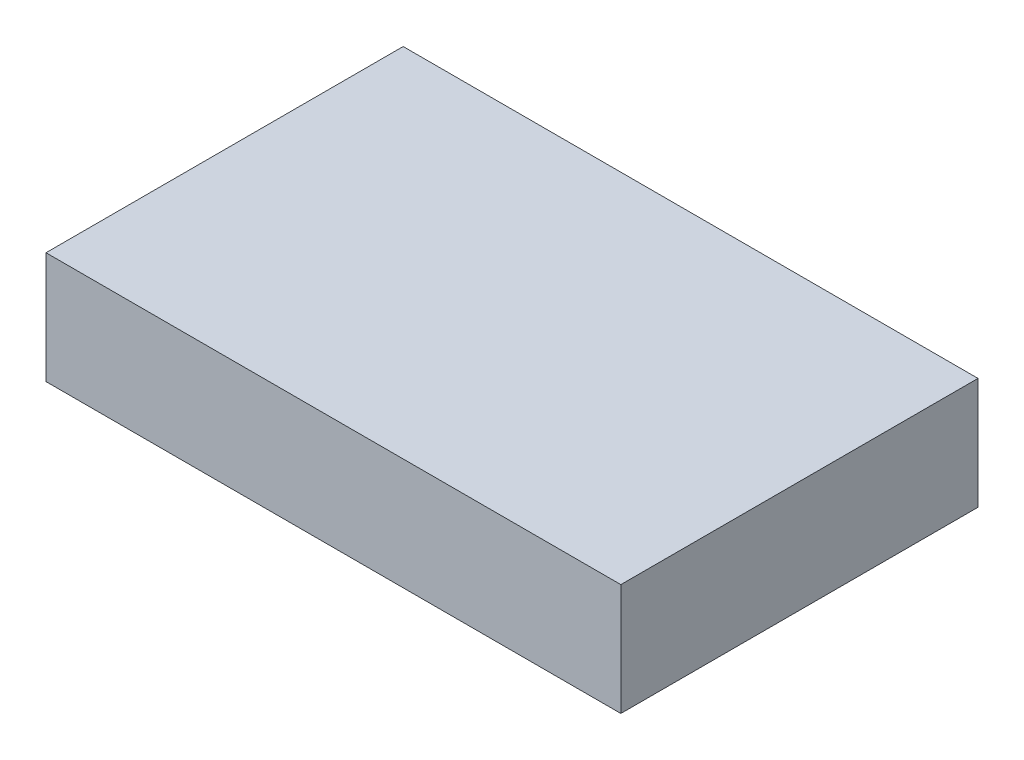
ISO-10303-21;
HEADER;
FILE_DESCRIPTION(('STEP AP214'),'2;1');
FILE_NAME('part.step','',(''),(''),'','','');
FILE_SCHEMA(('AUTOMOTIVE_DESIGN { 1 0 10303 214 1 1 1 1 }'));
ENDSEC;
DATA;
#1=APPLICATION_CONTEXT('core data for automotive mechanical design processes');
#2=APPLICATION_PROTOCOL_DEFINITION('international standard','automotive_design',2000,#1);
#3=PRODUCT_CONTEXT('',#1,'mechanical');
#4=PRODUCT('Part','Part','',(#3));
#5=PRODUCT_RELATED_PRODUCT_CATEGORY('part','',(#4));
#6=PRODUCT_DEFINITION_FORMATION('','',#4);
#7=PRODUCT_DEFINITION_CONTEXT('part definition',#1,'design');
#8=PRODUCT_DEFINITION('design','',#6,#7);
#9=PRODUCT_DEFINITION_SHAPE('','',#8);
#10=(LENGTH_UNIT() NAMED_UNIT(*) SI_UNIT(.MILLI.,.METRE.));
#11=(NAMED_UNIT(*) PLANE_ANGLE_UNIT() SI_UNIT($,.RADIAN.));
#12=(NAMED_UNIT(*) SI_UNIT($,.STERADIAN.) SOLID_ANGLE_UNIT());
#13=UNCERTAINTY_MEASURE_WITH_UNIT(LENGTH_MEASURE(1.E-05),#10,'distance_accuracy_value','');
#14=(GEOMETRIC_REPRESENTATION_CONTEXT(3) GLOBAL_UNCERTAINTY_ASSIGNED_CONTEXT((#13)) GLOBAL_UNIT_ASSIGNED_CONTEXT((#10,
#11,#12)) REPRESENTATION_CONTEXT('',''));
#15=CARTESIAN_POINT('',(0.,0.,0.));
#16=DIRECTION('',(0.,0.,1.));
#17=DIRECTION('',(1.,0.,0.));
#18=AXIS2_PLACEMENT_3D('',#15,#16,#17);
#19=CARTESIAN_POINT('',(6.5405,2.54,4.064));
#20=DIRECTION('',(-1.,0.,0.));
#21=DIRECTION('',(0.,0.,1.));
#22=AXIS2_PLACEMENT_3D('',#19,#20,#21);
#23=PLANE('',#22);
#24=DIRECTION('',(0.,0.,-1.));
#25=VECTOR('',#24,1.);
#26=CARTESIAN_POINT('',(6.5405,0.,4.064));
#27=LINE('',#26,#25);
#28=CARTESIAN_POINT('',(6.5405,0.,4.064));
#29=VERTEX_POINT('',#28);
#30=CARTESIAN_POINT('',(6.5405,0.,-4.064));
#31=VERTEX_POINT('',#30);
#32=EDGE_CURVE('E100',#29,#31,#27,.T.);
#33=ORIENTED_EDGE('',*,*,#32,.T.);
#34=DIRECTION('',(0.,-1.,0.));
#35=VECTOR('',#34,1.);
#36=CARTESIAN_POINT('',(6.5405,2.54,-4.064));
#37=LINE('',#36,#35);
#38=CARTESIAN_POINT('',(6.5405,2.54,-4.064));
#39=VERTEX_POINT('',#38);
#40=EDGE_CURVE('E11',#39,#31,#37,.T.);
#41=ORIENTED_EDGE('',*,*,#40,.F.);
#42=DIRECTION('',(0.,0.,-1.));
#43=VECTOR('',#42,1.);
#44=CARTESIAN_POINT('',(6.5405,2.54,4.064));
#45=LINE('',#44,#43);
#46=CARTESIAN_POINT('',(6.5405,2.54,4.064));
#47=VERTEX_POINT('',#46);
#48=EDGE_CURVE('E88',#47,#39,#45,.T.);
#49=ORIENTED_EDGE('',*,*,#48,.F.);
#50=DIRECTION('',(0.,-1.,0.));
#51=VECTOR('',#50,1.);
#52=CARTESIAN_POINT('',(6.5405,2.54,4.064));
#53=LINE('',#52,#51);
#54=EDGE_CURVE('E96',#47,#29,#53,.T.);
#55=ORIENTED_EDGE('',*,*,#54,.T.);
#56=EDGE_LOOP('',(#33,#41,#49,#55));
#57=FACE_BOUND('',#56,.T.);
#58=ADVANCED_FACE('F37',(#57),#23,.F.);
#59=CARTESIAN_POINT('',(-6.5405,2.54,-4.064));
#60=DIRECTION('',(0.,0.,1.));
#61=DIRECTION('',(1.,0.,0.));
#62=AXIS2_PLACEMENT_3D('',#59,#60,#61);
#63=PLANE('',#62);
#64=DIRECTION('',(-1.,0.,0.));
#65=VECTOR('',#64,1.);
#66=CARTESIAN_POINT('',(-6.5405,0.,-4.064));
#67=LINE('',#66,#65);
#68=CARTESIAN_POINT('',(-6.5405,0.,-4.064));
#69=VERTEX_POINT('',#68);
#70=EDGE_CURVE('E92',#31,#69,#67,.T.);
#71=ORIENTED_EDGE('',*,*,#70,.T.);
#72=DIRECTION('',(0.,-1.,0.));
#73=VECTOR('',#72,1.);
#74=CARTESIAN_POINT('',(-6.5405,2.54,-4.064));
#75=LINE('',#74,#73);
#76=CARTESIAN_POINT('',(-6.5405,2.54,-4.064));
#77=VERTEX_POINT('',#76);
#78=EDGE_CURVE('E45',#77,#69,#75,.T.);
#79=ORIENTED_EDGE('',*,*,#78,.F.);
#80=DIRECTION('',(-1.,0.,0.));
#81=VECTOR('',#80,1.);
#82=CARTESIAN_POINT('',(-6.5405,2.54,-4.064));
#83=LINE('',#82,#81);
#84=EDGE_CURVE('E83',#39,#77,#83,.T.);
#85=ORIENTED_EDGE('',*,*,#84,.F.);
#86=ORIENTED_EDGE('',*,*,#40,.T.);
#87=EDGE_LOOP('',(#71,#79,#85,#86));
#88=FACE_BOUND('',#87,.T.);
#89=ADVANCED_FACE('F91',(#88),#63,.F.);
#90=CARTESIAN_POINT('',(-6.5405,2.54,4.064));
#91=DIRECTION('',(1.,0.,0.));
#92=DIRECTION('',(0.,0.,-1.));
#93=AXIS2_PLACEMENT_3D('',#90,#91,#92);
#94=PLANE('',#93);
#95=DIRECTION('',(0.,0.,1.));
#96=VECTOR('',#95,1.);
#97=CARTESIAN_POINT('',(-6.5405,0.,4.064));
#98=LINE('',#97,#96);
#99=CARTESIAN_POINT('',(-6.5405,0.,4.064));
#100=VERTEX_POINT('',#99);
#101=EDGE_CURVE('E70',#69,#100,#98,.T.);
#102=ORIENTED_EDGE('',*,*,#101,.T.);
#103=DIRECTION('',(0.,-1.,0.));
#104=VECTOR('',#103,1.);
#105=CARTESIAN_POINT('',(-6.5405,2.54,4.064));
#106=LINE('',#105,#104);
#107=CARTESIAN_POINT('',(-6.5405,2.54,4.064));
#108=VERTEX_POINT('',#107);
#109=EDGE_CURVE('E93',#108,#100,#106,.T.);
#110=ORIENTED_EDGE('',*,*,#109,.F.);
#111=DIRECTION('',(0.,0.,1.));
#112=VECTOR('',#111,1.);
#113=CARTESIAN_POINT('',(-6.5405,2.54,4.064));
#114=LINE('',#113,#112);
#115=EDGE_CURVE('E86',#77,#108,#114,.T.);
#116=ORIENTED_EDGE('',*,*,#115,.F.);
#117=ORIENTED_EDGE('',*,*,#78,.T.);
#118=EDGE_LOOP('',(#102,#110,#116,#117));
#119=FACE_BOUND('',#118,.T.);
#120=ADVANCED_FACE('F94',(#119),#94,.F.);
#121=CARTESIAN_POINT('',(-6.5405,2.54,4.064));
#122=DIRECTION('',(0.,0.,-1.));
#123=DIRECTION('',(-1.,0.,0.));
#124=AXIS2_PLACEMENT_3D('',#121,#122,#123);
#125=PLANE('',#124);
#126=DIRECTION('',(1.,0.,0.));
#127=VECTOR('',#126,1.);
#128=CARTESIAN_POINT('',(-6.5405,0.,4.064));
#129=LINE('',#128,#127);
#130=EDGE_CURVE('E76',#100,#29,#129,.T.);
#131=ORIENTED_EDGE('',*,*,#130,.T.);
#132=ORIENTED_EDGE('',*,*,#54,.F.);
#133=DIRECTION('',(1.,0.,0.));
#134=VECTOR('',#133,1.);
#135=CARTESIAN_POINT('',(-6.5405,2.54,4.064));
#136=LINE('',#135,#134);
#137=EDGE_CURVE('E53',#108,#47,#136,.T.);
#138=ORIENTED_EDGE('',*,*,#137,.F.);
#139=ORIENTED_EDGE('',*,*,#109,.T.);
#140=EDGE_LOOP('',(#131,#132,#138,#139));
#141=FACE_BOUND('',#140,.T.);
#142=ADVANCED_FACE('F107',(#141),#125,.F.);
#143=CARTESIAN_POINT('',(0.,2.54,0.));
#144=DIRECTION('',(0.,-1.,0.));
#145=DIRECTION('',(0.,0.,-1.));
#146=AXIS2_PLACEMENT_3D('',#143,#144,#145);
#147=PLANE('',#146);
#148=ORIENTED_EDGE('',*,*,#48,.T.);
#149=ORIENTED_EDGE('',*,*,#84,.T.);
#150=ORIENTED_EDGE('',*,*,#115,.T.);
#151=ORIENTED_EDGE('',*,*,#137,.T.);
#152=EDGE_LOOP('',(#148,#149,#150,#151));
#153=FACE_BOUND('',#152,.T.);
#154=ADVANCED_FACE('F84',(#153),#147,.F.);
#155=CARTESIAN_POINT('',(0.,0.,0.));
#156=DIRECTION('',(0.,-1.,0.));
#157=DIRECTION('',(0.,0.,-1.));
#158=AXIS2_PLACEMENT_3D('',#155,#156,#157);
#159=PLANE('',#158);
#160=ORIENTED_EDGE('',*,*,#32,.F.);
#161=ORIENTED_EDGE('',*,*,#130,.F.);
#162=ORIENTED_EDGE('',*,*,#101,.F.);
#163=ORIENTED_EDGE('',*,*,#70,.F.);
#164=EDGE_LOOP('',(#160,#161,#162,#163));
#165=FACE_BOUND('',#164,.T.);
#166=ADVANCED_FACE('F110',(#165),#159,.T.);
#167=CLOSED_SHELL('',(#58,#89,#120,#142,#154,#166));
#168=MANIFOLD_SOLID_BREP('B2',#167);
#169=ADVANCED_BREP_SHAPE_REPRESENTATION('',(#18,#168),#14);
#170=SHAPE_DEFINITION_REPRESENTATION(#9,#169);
ENDSEC;
END-ISO-10303-21;
